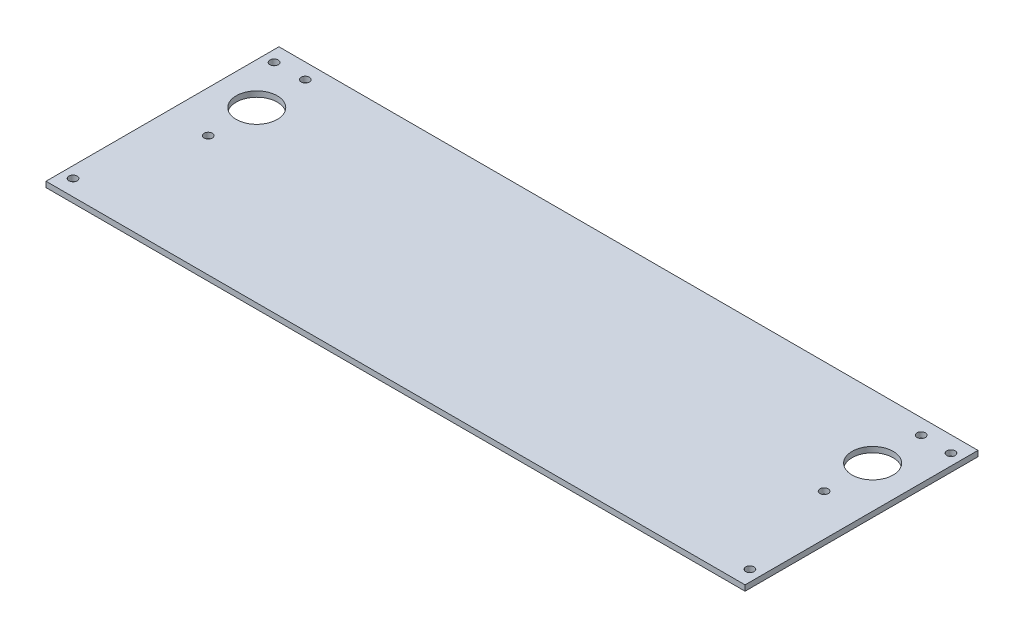
ISO-10303-21;
HEADER;
FILE_DESCRIPTION(('STEP AP214'),'2;1');
FILE_NAME('part.step','',(''),(''),'','','');
FILE_SCHEMA(('AUTOMOTIVE_DESIGN { 1 0 10303 214 1 1 1 1 }'));
ENDSEC;
DATA;
#1=APPLICATION_CONTEXT('core data for automotive mechanical design processes');
#2=APPLICATION_PROTOCOL_DEFINITION('international standard','automotive_design',2000,#1);
#3=PRODUCT_CONTEXT('',#1,'mechanical');
#4=PRODUCT('Part','Part','',(#3));
#5=PRODUCT_RELATED_PRODUCT_CATEGORY('part','',(#4));
#6=PRODUCT_DEFINITION_FORMATION('','',#4);
#7=PRODUCT_DEFINITION_CONTEXT('part definition',#1,'design');
#8=PRODUCT_DEFINITION('design','',#6,#7);
#9=PRODUCT_DEFINITION_SHAPE('','',#8);
#10=(LENGTH_UNIT() NAMED_UNIT(*) SI_UNIT(.MILLI.,.METRE.));
#11=(NAMED_UNIT(*) PLANE_ANGLE_UNIT() SI_UNIT($,.RADIAN.));
#12=(NAMED_UNIT(*) SI_UNIT($,.STERADIAN.) SOLID_ANGLE_UNIT());
#13=UNCERTAINTY_MEASURE_WITH_UNIT(LENGTH_MEASURE(1.E-05),#10,'distance_accuracy_value','');
#14=(GEOMETRIC_REPRESENTATION_CONTEXT(3) GLOBAL_UNCERTAINTY_ASSIGNED_CONTEXT((#13)) GLOBAL_UNIT_ASSIGNED_CONTEXT((#10,
#11,#12)) REPRESENTATION_CONTEXT('',''));
#15=CARTESIAN_POINT('',(0.,0.,0.));
#16=DIRECTION('',(0.,0.,1.));
#17=DIRECTION('',(1.,0.,0.));
#18=AXIS2_PLACEMENT_3D('',#15,#16,#17);
#19=CARTESIAN_POINT('',(-126.05,1.,42.));
#20=DIRECTION('',(1.,0.,0.));
#21=DIRECTION('',(0.,0.,-1.));
#22=AXIS2_PLACEMENT_3D('',#19,#20,#21);
#23=PLANE('',#22);
#24=DIRECTION('',(0.,0.,1.));
#25=VECTOR('',#24,1.);
#26=CARTESIAN_POINT('',(-126.05,-1.,42.));
#27=LINE('',#26,#25);
#28=CARTESIAN_POINT('',(-126.05,-1.,-42.));
#29=VERTEX_POINT('',#28);
#30=CARTESIAN_POINT('',(-126.05,-1.,42.));
#31=VERTEX_POINT('',#30);
#32=EDGE_CURVE('E100',#29,#31,#27,.T.);
#33=ORIENTED_EDGE('',*,*,#32,.T.);
#34=DIRECTION('',(0.,-1.,0.));
#35=VECTOR('',#34,1.);
#36=CARTESIAN_POINT('',(-126.05,1.,42.));
#37=LINE('',#36,#35);
#38=CARTESIAN_POINT('',(-126.05,1.,42.));
#39=VERTEX_POINT('',#38);
#40=EDGE_CURVE('E11',#39,#31,#37,.T.);
#41=ORIENTED_EDGE('',*,*,#40,.F.);
#42=DIRECTION('',(0.,0.,1.));
#43=VECTOR('',#42,1.);
#44=CARTESIAN_POINT('',(-126.05,1.,42.));
#45=LINE('',#44,#43);
#46=CARTESIAN_POINT('',(-126.05,1.,-42.));
#47=VERTEX_POINT('',#46);
#48=EDGE_CURVE('E87',#47,#39,#45,.T.);
#49=ORIENTED_EDGE('',*,*,#48,.F.);
#50=DIRECTION('',(0.,-1.,0.));
#51=VECTOR('',#50,1.);
#52=CARTESIAN_POINT('',(-126.05,1.,-42.));
#53=LINE('',#52,#51);
#54=EDGE_CURVE('E96',#47,#29,#53,.T.);
#55=ORIENTED_EDGE('',*,*,#54,.T.);
#56=EDGE_LOOP('',(#33,#41,#49,#55));
#57=FACE_BOUND('',#56,.T.);
#58=ADVANCED_FACE('F34',(#57),#23,.F.);
#59=CARTESIAN_POINT('',(126.05,1.,42.));
#60=DIRECTION('',(0.,0.,-1.));
#61=DIRECTION('',(-1.,0.,0.));
#62=AXIS2_PLACEMENT_3D('',#59,#60,#61);
#63=PLANE('',#62);
#64=DIRECTION('',(1.,0.,0.));
#65=VECTOR('',#64,1.);
#66=CARTESIAN_POINT('',(126.05,-1.,42.));
#67=LINE('',#66,#65);
#68=CARTESIAN_POINT('',(126.05,-1.,42.));
#69=VERTEX_POINT('',#68);
#70=EDGE_CURVE('E91',#31,#69,#67,.T.);
#71=ORIENTED_EDGE('',*,*,#70,.T.);
#72=DIRECTION('',(0.,-1.,0.));
#73=VECTOR('',#72,1.);
#74=CARTESIAN_POINT('',(126.05,1.,42.));
#75=LINE('',#74,#73);
#76=CARTESIAN_POINT('',(126.05,1.,42.));
#77=VERTEX_POINT('',#76);
#78=EDGE_CURVE('E43',#77,#69,#75,.T.);
#79=ORIENTED_EDGE('',*,*,#78,.F.);
#80=DIRECTION('',(1.,0.,0.));
#81=VECTOR('',#80,1.);
#82=CARTESIAN_POINT('',(126.05,1.,42.));
#83=LINE('',#82,#81);
#84=EDGE_CURVE('E82',#39,#77,#83,.T.);
#85=ORIENTED_EDGE('',*,*,#84,.F.);
#86=ORIENTED_EDGE('',*,*,#40,.T.);
#87=EDGE_LOOP('',(#71,#79,#85,#86));
#88=FACE_BOUND('',#87,.T.);
#89=ADVANCED_FACE('F90',(#88),#63,.F.);
#90=CARTESIAN_POINT('',(126.05,1.,42.));
#91=DIRECTION('',(-1.,0.,0.));
#92=DIRECTION('',(0.,0.,1.));
#93=AXIS2_PLACEMENT_3D('',#90,#91,#92);
#94=PLANE('',#93);
#95=DIRECTION('',(0.,0.,-1.));
#96=VECTOR('',#95,1.);
#97=CARTESIAN_POINT('',(126.05,-1.,42.));
#98=LINE('',#97,#96);
#99=CARTESIAN_POINT('',(126.05,-1.,-42.));
#100=VERTEX_POINT('',#99);
#101=EDGE_CURVE('E69',#69,#100,#98,.T.);
#102=ORIENTED_EDGE('',*,*,#101,.T.);
#103=DIRECTION('',(0.,-1.,0.));
#104=VECTOR('',#103,1.);
#105=CARTESIAN_POINT('',(126.05,1.,-42.));
#106=LINE('',#105,#104);
#107=CARTESIAN_POINT('',(126.05,1.,-42.));
#108=VERTEX_POINT('',#107);
#109=EDGE_CURVE('E92',#108,#100,#106,.T.);
#110=ORIENTED_EDGE('',*,*,#109,.F.);
#111=DIRECTION('',(0.,0.,-1.));
#112=VECTOR('',#111,1.);
#113=CARTESIAN_POINT('',(126.05,1.,42.));
#114=LINE('',#113,#112);
#115=EDGE_CURVE('E85',#77,#108,#114,.T.);
#116=ORIENTED_EDGE('',*,*,#115,.F.);
#117=ORIENTED_EDGE('',*,*,#78,.T.);
#118=EDGE_LOOP('',(#102,#110,#116,#117));
#119=FACE_BOUND('',#118,.T.);
#120=ADVANCED_FACE('F94',(#119),#94,.F.);
#121=CARTESIAN_POINT('',(126.05,1.,-42.));
#122=DIRECTION('',(0.,0.,1.));
#123=DIRECTION('',(1.,0.,0.));
#124=AXIS2_PLACEMENT_3D('',#121,#122,#123);
#125=PLANE('',#124);
#126=DIRECTION('',(-1.,0.,0.));
#127=VECTOR('',#126,1.);
#128=CARTESIAN_POINT('',(126.05,-1.,-42.));
#129=LINE('',#128,#127);
#130=EDGE_CURVE('E75',#100,#29,#129,.T.);
#131=ORIENTED_EDGE('',*,*,#130,.T.);
#132=ORIENTED_EDGE('',*,*,#54,.F.);
#133=DIRECTION('',(-1.,0.,0.));
#134=VECTOR('',#133,1.);
#135=CARTESIAN_POINT('',(126.05,1.,-42.));
#136=LINE('',#135,#134);
#137=EDGE_CURVE('E52',#108,#47,#136,.T.);
#138=ORIENTED_EDGE('',*,*,#137,.F.);
#139=ORIENTED_EDGE('',*,*,#109,.T.);
#140=EDGE_LOOP('',(#131,#132,#138,#139));
#141=FACE_BOUND('',#140,.T.);
#142=ADVANCED_FACE('F163',(#141),#125,.F.);
#143=CARTESIAN_POINT('',(0.,1.,0.));
#144=DIRECTION('',(0.,1.,0.));
#145=DIRECTION('',(0.,0.,1.));
#146=AXIS2_PLACEMENT_3D('',#143,#144,#145);
#147=PLANE('',#146);
#148=CARTESIAN_POINT('',(-111.05,1.,-36.5));
#149=DIRECTION('',(0.,1.,0.));
#150=DIRECTION('',(0.,0.,1.));
#151=AXIS2_PLACEMENT_3D('',#148,#149,#150);
#152=CIRCLE('',#151,1.5);
#153=CARTESIAN_POINT('',(-111.05,1.,-35.));
#154=VERTEX_POINT('',#153);
#155=EDGE_CURVE('E305',#154,#154,#152,.T.);
#156=ORIENTED_EDGE('',*,*,#155,.F.);
#157=EDGE_LOOP('',(#156));
#158=FACE_BOUND('',#157,.T.);
#159=CARTESIAN_POINT('',(111.050000000001,1.,-1.50000000000004));
#160=DIRECTION('',(0.,1.,0.));
#161=DIRECTION('',(0.,0.,1.));
#162=AXIS2_PLACEMENT_3D('',#159,#160,#161);
#163=CIRCLE('',#162,1.5);
#164=CARTESIAN_POINT('',(111.050000000001,1.,0.));
#165=VERTEX_POINT('',#164);
#166=EDGE_CURVE('E306',#165,#165,#163,.T.);
#167=ORIENTED_EDGE('',*,*,#166,.F.);
#168=EDGE_LOOP('',(#167));
#169=FACE_BOUND('',#168,.T.);
#170=CARTESIAN_POINT('',(111.050000000001,1.,-36.5));
#171=DIRECTION('',(0.,1.,0.));
#172=DIRECTION('',(0.,0.,1.));
#173=AXIS2_PLACEMENT_3D('',#170,#171,#172);
#174=CIRCLE('',#173,1.4999999999992);
#175=CARTESIAN_POINT('',(111.050000000001,1.,-35.0000000000008));
#176=VERTEX_POINT('',#175);
#177=EDGE_CURVE('E311',#176,#176,#174,.T.);
#178=ORIENTED_EDGE('',*,*,#177,.F.);
#179=EDGE_LOOP('',(#178));
#180=FACE_BOUND('',#179,.T.);
#181=CARTESIAN_POINT('',(-111.05,1.,-1.50000000000001));
#182=DIRECTION('',(0.,1.,0.));
#183=DIRECTION('',(0.,0.,1.));
#184=AXIS2_PLACEMENT_3D('',#181,#182,#183);
#185=CIRCLE('',#184,1.5);
#186=CARTESIAN_POINT('',(-111.05,1.,0.));
#187=VERTEX_POINT('',#186);
#188=EDGE_CURVE('E125',#187,#187,#185,.T.);
#189=ORIENTED_EDGE('',*,*,#188,.F.);
#190=EDGE_LOOP('',(#189));
#191=FACE_BOUND('',#190,.T.);
#192=CARTESIAN_POINT('',(-111.05,1.,-19.));
#193=DIRECTION('',(0.,1.,0.));
#194=DIRECTION('',(0.,0.,1.));
#195=AXIS2_PLACEMENT_3D('',#192,#193,#194);
#196=CIRCLE('',#195,7.40000000000001);
#197=CARTESIAN_POINT('',(-111.05,1.,-11.6));
#198=VERTEX_POINT('',#197);
#199=EDGE_CURVE('E141',#198,#198,#196,.T.);
#200=ORIENTED_EDGE('',*,*,#199,.F.);
#201=EDGE_LOOP('',(#200));
#202=FACE_BOUND('',#201,.T.);
#203=CARTESIAN_POINT('',(111.050000000001,1.,-19.));
#204=DIRECTION('',(0.,1.,0.));
#205=DIRECTION('',(0.,0.,1.));
#206=AXIS2_PLACEMENT_3D('',#203,#204,#205);
#207=CIRCLE('',#206,7.40000000000001);
#208=CARTESIAN_POINT('',(111.050000000001,1.,-11.6));
#209=VERTEX_POINT('',#208);
#210=EDGE_CURVE('E132',#209,#209,#207,.T.);
#211=ORIENTED_EDGE('',*,*,#210,.F.);
#212=EDGE_LOOP('',(#211));
#213=FACE_BOUND('',#212,.T.);
#214=CARTESIAN_POINT('',(122.05,1.,-36.25));
#215=DIRECTION('',(0.,1.,0.));
#216=DIRECTION('',(0.,0.,1.));
#217=AXIS2_PLACEMENT_3D('',#214,#215,#216);
#218=CIRCLE('',#217,1.5);
#219=CARTESIAN_POINT('',(122.05,1.,-34.75));
#220=VERTEX_POINT('',#219);
#221=EDGE_CURVE('E151',#220,#220,#218,.T.);
#222=ORIENTED_EDGE('',*,*,#221,.F.);
#223=EDGE_LOOP('',(#222));
#224=FACE_BOUND('',#223,.T.);
#225=CARTESIAN_POINT('',(122.05,1.,36.25));
#226=DIRECTION('',(0.,1.,0.));
#227=DIRECTION('',(0.,0.,1.));
#228=AXIS2_PLACEMENT_3D('',#225,#226,#227);
#229=CIRCLE('',#228,1.5);
#230=CARTESIAN_POINT('',(122.05,1.,37.75));
#231=VERTEX_POINT('',#230);
#232=EDGE_CURVE('E148',#231,#231,#229,.T.);
#233=ORIENTED_EDGE('',*,*,#232,.F.);
#234=EDGE_LOOP('',(#233));
#235=FACE_BOUND('',#234,.T.);
#236=CARTESIAN_POINT('',(-122.05,1.,36.25));
#237=DIRECTION('',(0.,1.,0.));
#238=DIRECTION('',(0.,0.,1.));
#239=AXIS2_PLACEMENT_3D('',#236,#237,#238);
#240=CIRCLE('',#239,1.5);
#241=CARTESIAN_POINT('',(-122.05,1.,37.75));
#242=VERTEX_POINT('',#241);
#243=EDGE_CURVE('E145',#242,#242,#240,.T.);
#244=ORIENTED_EDGE('',*,*,#243,.F.);
#245=EDGE_LOOP('',(#244));
#246=FACE_BOUND('',#245,.T.);
#247=CARTESIAN_POINT('',(-122.05,1.,-36.25));
#248=DIRECTION('',(0.,1.,0.));
#249=DIRECTION('',(0.,0.,1.));
#250=AXIS2_PLACEMENT_3D('',#247,#248,#249);
#251=CIRCLE('',#250,1.5);
#252=CARTESIAN_POINT('',(-122.05,1.,-34.75));
#253=VERTEX_POINT('',#252);
#254=EDGE_CURVE('E113',#253,#253,#251,.T.);
#255=ORIENTED_EDGE('',*,*,#254,.F.);
#256=EDGE_LOOP('',(#255));
#257=FACE_BOUND('',#256,.T.);
#258=ORIENTED_EDGE('',*,*,#48,.T.);
#259=ORIENTED_EDGE('',*,*,#84,.T.);
#260=ORIENTED_EDGE('',*,*,#115,.T.);
#261=ORIENTED_EDGE('',*,*,#137,.T.);
#262=EDGE_LOOP('',(#258,#259,#260,#261));
#263=FACE_BOUND('',#262,.T.);
#264=ADVANCED_FACE('F83',(#158,#169,#180,#191,#202,#213,#224,#235,#246,#257,#263),#147,.T.);
#265=CARTESIAN_POINT('',(0.,-1.,0.));
#266=DIRECTION('',(0.,1.,0.));
#267=DIRECTION('',(0.,0.,1.));
#268=AXIS2_PLACEMENT_3D('',#265,#266,#267);
#269=PLANE('',#268);
#270=CARTESIAN_POINT('',(-111.05,-1.,-36.5));
#271=DIRECTION('',(0.,1.,0.));
#272=DIRECTION('',(0.,0.,1.));
#273=AXIS2_PLACEMENT_3D('',#270,#271,#272);
#274=CIRCLE('',#273,1.5);
#275=CARTESIAN_POINT('',(-111.05,-1.,-35.));
#276=VERTEX_POINT('',#275);
#277=EDGE_CURVE('E37',#276,#276,#274,.T.);
#278=ORIENTED_EDGE('',*,*,#277,.T.);
#279=EDGE_LOOP('',(#278));
#280=FACE_BOUND('',#279,.T.);
#281=CARTESIAN_POINT('',(111.050000000001,-1.,-1.50000000000004));
#282=DIRECTION('',(0.,1.,0.));
#283=DIRECTION('',(0.,0.,1.));
#284=AXIS2_PLACEMENT_3D('',#281,#282,#283);
#285=CIRCLE('',#284,1.5);
#286=CARTESIAN_POINT('',(111.050000000001,-1.,0.));
#287=VERTEX_POINT('',#286);
#288=EDGE_CURVE('E127',#287,#287,#285,.T.);
#289=ORIENTED_EDGE('',*,*,#288,.T.);
#290=EDGE_LOOP('',(#289));
#291=FACE_BOUND('',#290,.T.);
#292=CARTESIAN_POINT('',(111.050000000001,-1.,-36.5));
#293=DIRECTION('',(0.,1.,0.));
#294=DIRECTION('',(0.,0.,1.));
#295=AXIS2_PLACEMENT_3D('',#292,#293,#294);
#296=CIRCLE('',#295,1.4999999999992);
#297=CARTESIAN_POINT('',(111.050000000001,-1.,-35.0000000000008));
#298=VERTEX_POINT('',#297);
#299=EDGE_CURVE('E124',#298,#298,#296,.T.);
#300=ORIENTED_EDGE('',*,*,#299,.T.);
#301=EDGE_LOOP('',(#300));
#302=FACE_BOUND('',#301,.T.);
#303=CARTESIAN_POINT('',(-111.05,-1.,-1.50000000000001));
#304=DIRECTION('',(0.,1.,0.));
#305=DIRECTION('',(0.,0.,1.));
#306=AXIS2_PLACEMENT_3D('',#303,#304,#305);
#307=CIRCLE('',#306,1.5);
#308=CARTESIAN_POINT('',(-111.05,-1.,0.));
#309=VERTEX_POINT('',#308);
#310=EDGE_CURVE('E121',#309,#309,#307,.T.);
#311=ORIENTED_EDGE('',*,*,#310,.T.);
#312=EDGE_LOOP('',(#311));
#313=FACE_BOUND('',#312,.T.);
#314=CARTESIAN_POINT('',(-111.05,-1.,-19.));
#315=DIRECTION('',(0.,1.,0.));
#316=DIRECTION('',(0.,0.,1.));
#317=AXIS2_PLACEMENT_3D('',#314,#315,#316);
#318=CIRCLE('',#317,7.40000000000001);
#319=CARTESIAN_POINT('',(-111.05,-1.,-11.6));
#320=VERTEX_POINT('',#319);
#321=EDGE_CURVE('E154',#320,#320,#318,.T.);
#322=ORIENTED_EDGE('',*,*,#321,.T.);
#323=EDGE_LOOP('',(#322));
#324=FACE_BOUND('',#323,.T.);
#325=CARTESIAN_POINT('',(111.050000000001,-1.,-19.));
#326=DIRECTION('',(0.,1.,0.));
#327=DIRECTION('',(0.,0.,1.));
#328=AXIS2_PLACEMENT_3D('',#325,#326,#327);
#329=CIRCLE('',#328,7.40000000000001);
#330=CARTESIAN_POINT('',(111.050000000001,-1.,-11.6));
#331=VERTEX_POINT('',#330);
#332=EDGE_CURVE('E136',#331,#331,#329,.T.);
#333=ORIENTED_EDGE('',*,*,#332,.T.);
#334=EDGE_LOOP('',(#333));
#335=FACE_BOUND('',#334,.T.);
#336=CARTESIAN_POINT('',(122.05,-1.,-36.25));
#337=DIRECTION('',(0.,1.,0.));
#338=DIRECTION('',(0.,0.,1.));
#339=AXIS2_PLACEMENT_3D('',#336,#337,#338);
#340=CIRCLE('',#339,1.5);
#341=CARTESIAN_POINT('',(122.05,-1.,-34.75));
#342=VERTEX_POINT('',#341);
#343=EDGE_CURVE('E103',#342,#342,#340,.T.);
#344=ORIENTED_EDGE('',*,*,#343,.T.);
#345=EDGE_LOOP('',(#344));
#346=FACE_BOUND('',#345,.T.);
#347=CARTESIAN_POINT('',(122.05,-1.,36.25));
#348=DIRECTION('',(0.,1.,0.));
#349=DIRECTION('',(0.,0.,1.));
#350=AXIS2_PLACEMENT_3D('',#347,#348,#349);
#351=CIRCLE('',#350,1.5);
#352=CARTESIAN_POINT('',(122.05,-1.,37.75));
#353=VERTEX_POINT('',#352);
#354=EDGE_CURVE('E116',#353,#353,#351,.T.);
#355=ORIENTED_EDGE('',*,*,#354,.T.);
#356=EDGE_LOOP('',(#355));
#357=FACE_BOUND('',#356,.T.);
#358=CARTESIAN_POINT('',(-122.05,-1.,36.25));
#359=DIRECTION('',(0.,1.,0.));
#360=DIRECTION('',(0.,0.,1.));
#361=AXIS2_PLACEMENT_3D('',#358,#359,#360);
#362=CIRCLE('',#361,1.5);
#363=CARTESIAN_POINT('',(-122.05,-1.,37.75));
#364=VERTEX_POINT('',#363);
#365=EDGE_CURVE('E112',#364,#364,#362,.T.);
#366=ORIENTED_EDGE('',*,*,#365,.T.);
#367=EDGE_LOOP('',(#366));
#368=FACE_BOUND('',#367,.T.);
#369=CARTESIAN_POINT('',(-122.05,-1.,-36.25));
#370=DIRECTION('',(0.,1.,0.));
#371=DIRECTION('',(0.,0.,1.));
#372=AXIS2_PLACEMENT_3D('',#369,#370,#371);
#373=CIRCLE('',#372,1.5);
#374=CARTESIAN_POINT('',(-122.05,-1.,-34.75));
#375=VERTEX_POINT('',#374);
#376=EDGE_CURVE('E109',#375,#375,#373,.T.);
#377=ORIENTED_EDGE('',*,*,#376,.T.);
#378=EDGE_LOOP('',(#377));
#379=FACE_BOUND('',#378,.T.);
#380=ORIENTED_EDGE('',*,*,#32,.F.);
#381=ORIENTED_EDGE('',*,*,#130,.F.);
#382=ORIENTED_EDGE('',*,*,#101,.F.);
#383=ORIENTED_EDGE('',*,*,#70,.F.);
#384=EDGE_LOOP('',(#380,#381,#382,#383));
#385=FACE_BOUND('',#384,.T.);
#386=ADVANCED_FACE('F162',(#280,#291,#302,#313,#324,#335,#346,#357,#368,#379,#385),#269,.F.);
#387=CARTESIAN_POINT('',(-122.05,-9.,-36.25));
#388=DIRECTION('',(0.,1.,0.));
#389=DIRECTION('',(0.,0.,1.));
#390=AXIS2_PLACEMENT_3D('',#387,#388,#389);
#391=CYLINDRICAL_SURFACE('',#390,1.5);
#392=ORIENTED_EDGE('',*,*,#254,.T.);
#393=EDGE_LOOP('',(#392));
#394=FACE_BOUND('',#393,.T.);
#395=ORIENTED_EDGE('',*,*,#376,.F.);
#396=EDGE_LOOP('',(#395));
#397=FACE_BOUND('',#396,.T.);
#398=ADVANCED_FACE('F158',(#394,#397),#391,.F.);
#399=CARTESIAN_POINT('',(-122.05,-9.,36.25));
#400=DIRECTION('',(0.,1.,0.));
#401=DIRECTION('',(0.,0.,1.));
#402=AXIS2_PLACEMENT_3D('',#399,#400,#401);
#403=CYLINDRICAL_SURFACE('',#402,1.5);
#404=ORIENTED_EDGE('',*,*,#243,.T.);
#405=EDGE_LOOP('',(#404));
#406=FACE_BOUND('',#405,.T.);
#407=ORIENTED_EDGE('',*,*,#365,.F.);
#408=EDGE_LOOP('',(#407));
#409=FACE_BOUND('',#408,.T.);
#410=ADVANCED_FACE('F202',(#406,#409),#403,.F.);
#411=CARTESIAN_POINT('',(122.05,-9.,36.25));
#412=DIRECTION('',(0.,1.,0.));
#413=DIRECTION('',(0.,0.,1.));
#414=AXIS2_PLACEMENT_3D('',#411,#412,#413);
#415=CYLINDRICAL_SURFACE('',#414,1.5);
#416=ORIENTED_EDGE('',*,*,#232,.T.);
#417=EDGE_LOOP('',(#416));
#418=FACE_BOUND('',#417,.T.);
#419=ORIENTED_EDGE('',*,*,#354,.F.);
#420=EDGE_LOOP('',(#419));
#421=FACE_BOUND('',#420,.T.);
#422=ADVANCED_FACE('F211',(#418,#421),#415,.F.);
#423=CARTESIAN_POINT('',(122.05,-9.,-36.25));
#424=DIRECTION('',(0.,1.,0.));
#425=DIRECTION('',(0.,0.,1.));
#426=AXIS2_PLACEMENT_3D('',#423,#424,#425);
#427=CYLINDRICAL_SURFACE('',#426,1.5);
#428=ORIENTED_EDGE('',*,*,#221,.T.);
#429=EDGE_LOOP('',(#428));
#430=FACE_BOUND('',#429,.T.);
#431=ORIENTED_EDGE('',*,*,#343,.F.);
#432=EDGE_LOOP('',(#431));
#433=FACE_BOUND('',#432,.T.);
#434=ADVANCED_FACE('F221',(#430,#433),#427,.F.);
#435=CARTESIAN_POINT('',(111.050000000001,-1.,-19.));
#436=DIRECTION('',(0.,1.,0.));
#437=DIRECTION('',(0.,0.,1.));
#438=AXIS2_PLACEMENT_3D('',#435,#436,#437);
#439=CYLINDRICAL_SURFACE('',#438,7.40000000000001);
#440=ORIENTED_EDGE('',*,*,#332,.F.);
#441=EDGE_LOOP('',(#440));
#442=FACE_BOUND('',#441,.T.);
#443=ORIENTED_EDGE('',*,*,#210,.T.);
#444=EDGE_LOOP('',(#443));
#445=FACE_BOUND('',#444,.T.);
#446=ADVANCED_FACE('F231',(#442,#445),#439,.F.);
#447=CARTESIAN_POINT('',(-111.05,-1.,-19.));
#448=DIRECTION('',(0.,1.,0.));
#449=DIRECTION('',(0.,0.,1.));
#450=AXIS2_PLACEMENT_3D('',#447,#448,#449);
#451=CYLINDRICAL_SURFACE('',#450,7.40000000000001);
#452=ORIENTED_EDGE('',*,*,#321,.F.);
#453=EDGE_LOOP('',(#452));
#454=FACE_BOUND('',#453,.T.);
#455=ORIENTED_EDGE('',*,*,#199,.T.);
#456=EDGE_LOOP('',(#455));
#457=FACE_BOUND('',#456,.T.);
#458=ADVANCED_FACE('F241',(#454,#457),#451,.F.);
#459=CARTESIAN_POINT('',(-111.05,-9.,-1.50000000000001));
#460=DIRECTION('',(0.,1.,0.));
#461=DIRECTION('',(0.,0.,1.));
#462=AXIS2_PLACEMENT_3D('',#459,#460,#461);
#463=CYLINDRICAL_SURFACE('',#462,1.5);
#464=ORIENTED_EDGE('',*,*,#188,.T.);
#465=EDGE_LOOP('',(#464));
#466=FACE_BOUND('',#465,.T.);
#467=ORIENTED_EDGE('',*,*,#310,.F.);
#468=EDGE_LOOP('',(#467));
#469=FACE_BOUND('',#468,.T.);
#470=ADVANCED_FACE('F250',(#466,#469),#463,.F.);
#471=CARTESIAN_POINT('',(111.050000000001,-9.,-36.5));
#472=DIRECTION('',(0.,1.,0.));
#473=DIRECTION('',(0.,0.,1.));
#474=AXIS2_PLACEMENT_3D('',#471,#472,#473);
#475=CYLINDRICAL_SURFACE('',#474,1.4999999999992);
#476=ORIENTED_EDGE('',*,*,#177,.T.);
#477=EDGE_LOOP('',(#476));
#478=FACE_BOUND('',#477,.T.);
#479=ORIENTED_EDGE('',*,*,#299,.F.);
#480=EDGE_LOOP('',(#479));
#481=FACE_BOUND('',#480,.T.);
#482=ADVANCED_FACE('F269',(#478,#481),#475,.F.);
#483=CARTESIAN_POINT('',(111.050000000001,-9.,-1.50000000000004));
#484=DIRECTION('',(0.,1.,0.));
#485=DIRECTION('',(0.,0.,1.));
#486=AXIS2_PLACEMENT_3D('',#483,#484,#485);
#487=CYLINDRICAL_SURFACE('',#486,1.5);
#488=ORIENTED_EDGE('',*,*,#166,.T.);
#489=EDGE_LOOP('',(#488));
#490=FACE_BOUND('',#489,.T.);
#491=ORIENTED_EDGE('',*,*,#288,.F.);
#492=EDGE_LOOP('',(#491));
#493=FACE_BOUND('',#492,.T.);
#494=ADVANCED_FACE('F279',(#490,#493),#487,.F.);
#495=CARTESIAN_POINT('',(-111.05,-9.,-36.5));
#496=DIRECTION('',(0.,1.,0.));
#497=DIRECTION('',(0.,0.,1.));
#498=AXIS2_PLACEMENT_3D('',#495,#496,#497);
#499=CYLINDRICAL_SURFACE('',#498,1.5);
#500=ORIENTED_EDGE('',*,*,#155,.T.);
#501=EDGE_LOOP('',(#500));
#502=FACE_BOUND('',#501,.T.);
#503=ORIENTED_EDGE('',*,*,#277,.F.);
#504=EDGE_LOOP('',(#503));
#505=FACE_BOUND('',#504,.T.);
#506=ADVANCED_FACE('F289',(#502,#505),#499,.F.);
#507=CLOSED_SHELL('',(#58,#89,#120,#142,#264,#386,#398,#410,#422,#434,#446,#458,#470,#482,#494,#506));
#508=MANIFOLD_SOLID_BREP('B2',#507);
#509=ADVANCED_BREP_SHAPE_REPRESENTATION('',(#18,#508),#14);
#510=SHAPE_DEFINITION_REPRESENTATION(#9,#509);
ENDSEC;
END-ISO-10303-21;
